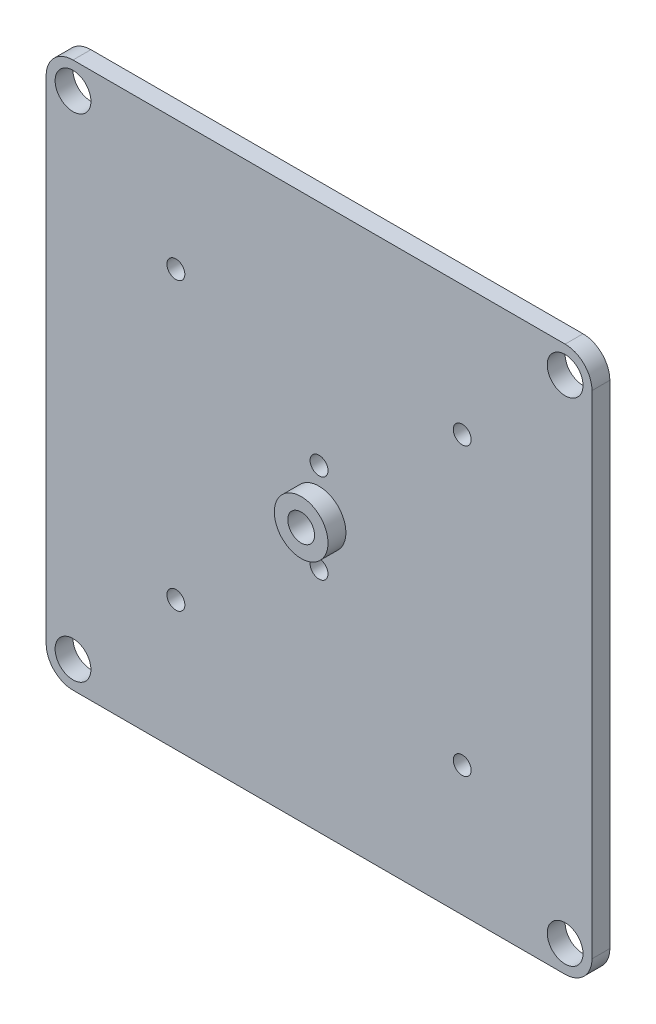
ISO-10303-21;
HEADER;
FILE_DESCRIPTION(('STEP AP214'),'2;1');
FILE_NAME('part.step','',(''),(''),'','','');
FILE_SCHEMA(('AUTOMOTIVE_DESIGN { 1 0 10303 214 1 1 1 1 }'));
ENDSEC;
DATA;
#1=APPLICATION_CONTEXT('core data for automotive mechanical design processes');
#2=APPLICATION_PROTOCOL_DEFINITION('international standard','automotive_design',2000,#1);
#3=PRODUCT_CONTEXT('',#1,'mechanical');
#4=PRODUCT('Part','Part','',(#3));
#5=PRODUCT_RELATED_PRODUCT_CATEGORY('part','',(#4));
#6=PRODUCT_DEFINITION_FORMATION('','',#4);
#7=PRODUCT_DEFINITION_CONTEXT('part definition',#1,'design');
#8=PRODUCT_DEFINITION('design','',#6,#7);
#9=PRODUCT_DEFINITION_SHAPE('','',#8);
#10=(LENGTH_UNIT() NAMED_UNIT(*) SI_UNIT(.MILLI.,.METRE.));
#11=(NAMED_UNIT(*) PLANE_ANGLE_UNIT() SI_UNIT($,.RADIAN.));
#12=(NAMED_UNIT(*) SI_UNIT($,.STERADIAN.) SOLID_ANGLE_UNIT());
#13=UNCERTAINTY_MEASURE_WITH_UNIT(LENGTH_MEASURE(1.E-05),#10,'distance_accuracy_value','');
#14=(GEOMETRIC_REPRESENTATION_CONTEXT(3) GLOBAL_UNCERTAINTY_ASSIGNED_CONTEXT((#13)) GLOBAL_UNIT_ASSIGNED_CONTEXT((#10,
#11,#12)) REPRESENTATION_CONTEXT('',''));
#15=CARTESIAN_POINT('',(0.,0.,0.));
#16=DIRECTION('',(0.,0.,1.));
#17=DIRECTION('',(1.,0.,0.));
#18=AXIS2_PLACEMENT_3D('',#15,#16,#17);
#19=CARTESIAN_POINT('',(-152.5,-152.5,10.));
#20=DIRECTION('',(1.,0.,0.));
#21=DIRECTION('',(0.,1.,0.));
#22=AXIS2_PLACEMENT_3D('',#19,#20,#21);
#23=PLANE('',#22);
#24=DIRECTION('',(0.,-1.,0.));
#25=VECTOR('',#24,1.);
#26=CARTESIAN_POINT('',(-152.5,-152.5,0.));
#27=LINE('',#26,#25);
#28=CARTESIAN_POINT('',(-152.5,137.5,0.));
#29=VERTEX_POINT('',#28);
#30=CARTESIAN_POINT('',(-152.5,-137.5,0.));
#31=VERTEX_POINT('',#30);
#32=EDGE_CURVE('E189',#29,#31,#27,.T.);
#33=ORIENTED_EDGE('',*,*,#32,.T.);
#34=DIRECTION('',(0.,0.,-1.));
#35=VECTOR('',#34,1.);
#36=CARTESIAN_POINT('',(-152.5,-137.5,10.));
#37=LINE('',#36,#35);
#38=CARTESIAN_POINT('',(-152.5,-137.5,10.));
#39=VERTEX_POINT('',#38);
#40=EDGE_CURVE('E50',#31,#39,#37,.F.);
#41=ORIENTED_EDGE('',*,*,#40,.T.);
#42=DIRECTION('',(0.,-1.,0.));
#43=VECTOR('',#42,1.);
#44=CARTESIAN_POINT('',(-152.5,-152.5,10.));
#45=LINE('',#44,#43);
#46=CARTESIAN_POINT('',(-152.5,137.5,10.));
#47=VERTEX_POINT('',#46);
#48=EDGE_CURVE('E138',#47,#39,#45,.T.);
#49=ORIENTED_EDGE('',*,*,#48,.F.);
#50=DIRECTION('',(0.,0.,-1.));
#51=VECTOR('',#50,1.);
#52=CARTESIAN_POINT('',(-152.5,137.5,10.));
#53=LINE('',#52,#51);
#54=EDGE_CURVE('E180',#47,#29,#53,.T.);
#55=ORIENTED_EDGE('',*,*,#54,.T.);
#56=EDGE_LOOP('',(#33,#41,#49,#55));
#57=FACE_BOUND('',#56,.T.);
#58=ADVANCED_FACE('F41',(#57),#23,.F.);
#59=CARTESIAN_POINT('',(-152.5,-152.5,10.));
#60=DIRECTION('',(0.,1.,0.));
#61=DIRECTION('',(0.,0.,1.));
#62=AXIS2_PLACEMENT_3D('',#59,#60,#61);
#63=PLANE('',#62);
#64=DIRECTION('',(1.,0.,0.));
#65=VECTOR('',#64,1.);
#66=CARTESIAN_POINT('',(-152.5,-152.5,0.));
#67=LINE('',#66,#65);
#68=CARTESIAN_POINT('',(-137.5,-152.5,0.));
#69=VERTEX_POINT('',#68);
#70=CARTESIAN_POINT('',(137.5,-152.5,0.));
#71=VERTEX_POINT('',#70);
#72=EDGE_CURVE('E145',#69,#71,#67,.T.);
#73=ORIENTED_EDGE('',*,*,#72,.T.);
#74=DIRECTION('',(0.,0.,-1.));
#75=VECTOR('',#74,1.);
#76=CARTESIAN_POINT('',(137.5,-152.5,10.));
#77=LINE('',#76,#75);
#78=CARTESIAN_POINT('',(137.5,-152.5,10.));
#79=VERTEX_POINT('',#78);
#80=EDGE_CURVE('E57',#71,#79,#77,.F.);
#81=ORIENTED_EDGE('',*,*,#80,.T.);
#82=DIRECTION('',(1.,0.,0.));
#83=VECTOR('',#82,1.);
#84=CARTESIAN_POINT('',(-152.5,-152.5,10.));
#85=LINE('',#84,#83);
#86=CARTESIAN_POINT('',(-137.5,-152.5,10.));
#87=VERTEX_POINT('',#86);
#88=EDGE_CURVE('E143',#87,#79,#85,.T.);
#89=ORIENTED_EDGE('',*,*,#88,.F.);
#90=DIRECTION('',(0.,0.,-1.));
#91=VECTOR('',#90,1.);
#92=CARTESIAN_POINT('',(-137.5,-152.5,10.));
#93=LINE('',#92,#91);
#94=EDGE_CURVE('E174',#87,#69,#93,.T.);
#95=ORIENTED_EDGE('',*,*,#94,.T.);
#96=EDGE_LOOP('',(#73,#81,#89,#95));
#97=FACE_BOUND('',#96,.T.);
#98=ADVANCED_FACE('F197',(#97),#63,.F.);
#99=CARTESIAN_POINT('',(152.5,-152.5,10.));
#100=DIRECTION('',(-1.,0.,0.));
#101=DIRECTION('',(0.,-1.,0.));
#102=AXIS2_PLACEMENT_3D('',#99,#100,#101);
#103=PLANE('',#102);
#104=DIRECTION('',(0.,1.,0.));
#105=VECTOR('',#104,1.);
#106=CARTESIAN_POINT('',(152.5,-152.5,0.));
#107=LINE('',#106,#105);
#108=CARTESIAN_POINT('',(152.5,-137.5,0.));
#109=VERTEX_POINT('',#108);
#110=CARTESIAN_POINT('',(152.5,137.5,0.));
#111=VERTEX_POINT('',#110);
#112=EDGE_CURVE('E139',#109,#111,#107,.T.);
#113=ORIENTED_EDGE('',*,*,#112,.T.);
#114=DIRECTION('',(0.,0.,-1.));
#115=VECTOR('',#114,1.);
#116=CARTESIAN_POINT('',(152.5,137.5,10.));
#117=LINE('',#116,#115);
#118=CARTESIAN_POINT('',(152.5,137.5,10.));
#119=VERTEX_POINT('',#118);
#120=EDGE_CURVE('E114',#111,#119,#117,.F.);
#121=ORIENTED_EDGE('',*,*,#120,.T.);
#122=DIRECTION('',(0.,1.,0.));
#123=VECTOR('',#122,1.);
#124=CARTESIAN_POINT('',(152.5,-152.5,10.));
#125=LINE('',#124,#123);
#126=CARTESIAN_POINT('',(152.5,-137.5,10.));
#127=VERTEX_POINT('',#126);
#128=EDGE_CURVE('E205',#127,#119,#125,.T.);
#129=ORIENTED_EDGE('',*,*,#128,.F.);
#130=DIRECTION('',(0.,0.,-1.));
#131=VECTOR('',#130,1.);
#132=CARTESIAN_POINT('',(152.5,-137.5,10.));
#133=LINE('',#132,#131);
#134=EDGE_CURVE('E120',#127,#109,#133,.T.);
#135=ORIENTED_EDGE('',*,*,#134,.T.);
#136=EDGE_LOOP('',(#113,#121,#129,#135));
#137=FACE_BOUND('',#136,.T.);
#138=ADVANCED_FACE('F354',(#137),#103,.F.);
#139=CARTESIAN_POINT('',(-152.5,152.5,10.));
#140=DIRECTION('',(0.,-1.,0.));
#141=DIRECTION('',(1.,0.,0.));
#142=AXIS2_PLACEMENT_3D('',#139,#140,#141);
#143=PLANE('',#142);
#144=DIRECTION('',(-1.,0.,0.));
#145=VECTOR('',#144,1.);
#146=CARTESIAN_POINT('',(-152.5,152.5,10.));
#147=LINE('',#146,#145);
#148=CARTESIAN_POINT('',(137.5,152.5,10.));
#149=VERTEX_POINT('',#148);
#150=CARTESIAN_POINT('',(-137.5,152.5,10.));
#151=VERTEX_POINT('',#150);
#152=EDGE_CURVE('E130',#149,#151,#147,.T.);
#153=ORIENTED_EDGE('',*,*,#152,.F.);
#154=DIRECTION('',(0.,0.,-1.));
#155=VECTOR('',#154,1.);
#156=CARTESIAN_POINT('',(137.5,152.5,10.));
#157=LINE('',#156,#155);
#158=CARTESIAN_POINT('',(137.5,152.5,0.));
#159=VERTEX_POINT('',#158);
#160=EDGE_CURVE('E113',#149,#159,#157,.T.);
#161=ORIENTED_EDGE('',*,*,#160,.T.);
#162=DIRECTION('',(-1.,0.,0.));
#163=VECTOR('',#162,1.);
#164=CARTESIAN_POINT('',(-152.5,152.5,0.));
#165=LINE('',#164,#163);
#166=CARTESIAN_POINT('',(-137.5,152.5,0.));
#167=VERTEX_POINT('',#166);
#168=EDGE_CURVE('E127',#159,#167,#165,.T.);
#169=ORIENTED_EDGE('',*,*,#168,.T.);
#170=DIRECTION('',(0.,0.,-1.));
#171=VECTOR('',#170,1.);
#172=CARTESIAN_POINT('',(-137.5,152.5,10.));
#173=LINE('',#172,#171);
#174=EDGE_CURVE('E133',#167,#151,#173,.F.);
#175=ORIENTED_EDGE('',*,*,#174,.T.);
#176=EDGE_LOOP('',(#153,#161,#169,#175));
#177=FACE_BOUND('',#176,.T.);
#178=ADVANCED_FACE('F126',(#177),#143,.F.);
#179=CARTESIAN_POINT('',(0.,0.,10.));
#180=DIRECTION('',(0.,0.,-1.));
#181=DIRECTION('',(-1.,0.,0.));
#182=AXIS2_PLACEMENT_3D('',#179,#180,#181);
#183=PLANE('',#182);
#184=CARTESIAN_POINT('',(0.,25.,10.));
#185=DIRECTION('',(0.,0.,1.));
#186=DIRECTION('',(1.,0.,0.));
#187=AXIS2_PLACEMENT_3D('',#184,#185,#186);
#188=CIRCLE('',#187,5.);
#189=CARTESIAN_POINT('',(5.,25.,10.));
#190=VERTEX_POINT('',#189);
#191=EDGE_CURVE('E294',#190,#190,#188,.T.);
#192=ORIENTED_EDGE('',*,*,#191,.F.);
#193=EDGE_LOOP('',(#192));
#194=FACE_BOUND('',#193,.T.);
#195=CARTESIAN_POINT('',(0.,-25.,10.));
#196=DIRECTION('',(0.,0.,1.));
#197=DIRECTION('',(1.,0.,0.));
#198=AXIS2_PLACEMENT_3D('',#195,#196,#197);
#199=CIRCLE('',#198,5.);
#200=CARTESIAN_POINT('',(5.00000000000001,-25.,10.));
#201=VERTEX_POINT('',#200);
#202=EDGE_CURVE('E286',#201,#201,#199,.T.);
#203=ORIENTED_EDGE('',*,*,#202,.F.);
#204=EDGE_LOOP('',(#203));
#205=FACE_BOUND('',#204,.T.);
#206=CARTESIAN_POINT('',(0.,0.,10.));
#207=DIRECTION('',(0.,0.,-1.));
#208=DIRECTION('',(-1.,0.,0.));
#209=AXIS2_PLACEMENT_3D('',#206,#207,#208);
#210=CIRCLE('',#209,15.);
#211=CARTESIAN_POINT('',(-15.,0.,10.));
#212=VERTEX_POINT('',#211);
#213=EDGE_CURVE('E11',#212,#212,#210,.F.);
#214=ORIENTED_EDGE('',*,*,#213,.F.);
#215=EDGE_LOOP('',(#214));
#216=FACE_BOUND('',#215,.T.);
#217=CARTESIAN_POINT('',(-80.,80.,10.));
#218=DIRECTION('',(0.,0.,1.));
#219=DIRECTION('',(1.,0.,0.));
#220=AXIS2_PLACEMENT_3D('',#217,#218,#219);
#221=CIRCLE('',#220,5.00000000000001);
#222=CARTESIAN_POINT('',(-75.,80.,10.));
#223=VERTEX_POINT('',#222);
#224=EDGE_CURVE('E250',#223,#223,#221,.T.);
#225=ORIENTED_EDGE('',*,*,#224,.F.);
#226=EDGE_LOOP('',(#225));
#227=FACE_BOUND('',#226,.T.);
#228=CARTESIAN_POINT('',(-80.,-80.,10.));
#229=DIRECTION('',(0.,0.,1.));
#230=DIRECTION('',(1.,0.,0.));
#231=AXIS2_PLACEMENT_3D('',#228,#229,#230);
#232=CIRCLE('',#231,5.00000000000001);
#233=CARTESIAN_POINT('',(-75.,-80.,10.));
#234=VERTEX_POINT('',#233);
#235=EDGE_CURVE('E259',#234,#234,#232,.T.);
#236=ORIENTED_EDGE('',*,*,#235,.F.);
#237=EDGE_LOOP('',(#236));
#238=FACE_BOUND('',#237,.T.);
#239=CARTESIAN_POINT('',(80.,-80.,10.));
#240=DIRECTION('',(0.,0.,1.));
#241=DIRECTION('',(1.,0.,0.));
#242=AXIS2_PLACEMENT_3D('',#239,#240,#241);
#243=CIRCLE('',#242,5.00000000000001);
#244=CARTESIAN_POINT('',(85.,-80.,10.));
#245=VERTEX_POINT('',#244);
#246=EDGE_CURVE('E267',#245,#245,#243,.T.);
#247=ORIENTED_EDGE('',*,*,#246,.F.);
#248=EDGE_LOOP('',(#247));
#249=FACE_BOUND('',#248,.T.);
#250=CARTESIAN_POINT('',(80.,80.,10.));
#251=DIRECTION('',(0.,0.,1.));
#252=DIRECTION('',(1.,0.,0.));
#253=AXIS2_PLACEMENT_3D('',#250,#251,#252);
#254=CIRCLE('',#253,5.00000000000001);
#255=CARTESIAN_POINT('',(85.,80.,10.));
#256=VERTEX_POINT('',#255);
#257=EDGE_CURVE('E242',#256,#256,#254,.T.);
#258=ORIENTED_EDGE('',*,*,#257,.F.);
#259=EDGE_LOOP('',(#258));
#260=FACE_BOUND('',#259,.T.);
#261=CARTESIAN_POINT('',(-137.5,137.5,10.));
#262=DIRECTION('',(0.,0.,1.));
#263=DIRECTION('',(1.,0.,0.));
#264=AXIS2_PLACEMENT_3D('',#261,#262,#263);
#265=CIRCLE('',#264,10.);
#266=CARTESIAN_POINT('',(-127.5,137.5,10.));
#267=VERTEX_POINT('',#266);
#268=EDGE_CURVE('E218',#267,#267,#265,.T.);
#269=ORIENTED_EDGE('',*,*,#268,.F.);
#270=EDGE_LOOP('',(#269));
#271=FACE_BOUND('',#270,.T.);
#272=CARTESIAN_POINT('',(-137.5,-137.5,10.));
#273=DIRECTION('',(0.,0.,1.));
#274=DIRECTION('',(1.,0.,0.));
#275=AXIS2_PLACEMENT_3D('',#272,#273,#274);
#276=CIRCLE('',#275,10.);
#277=CARTESIAN_POINT('',(-127.5,-137.5,10.));
#278=VERTEX_POINT('',#277);
#279=EDGE_CURVE('E227',#278,#278,#276,.T.);
#280=ORIENTED_EDGE('',*,*,#279,.F.);
#281=EDGE_LOOP('',(#280));
#282=FACE_BOUND('',#281,.T.);
#283=CARTESIAN_POINT('',(137.5,-137.5,10.));
#284=DIRECTION('',(0.,0.,1.));
#285=DIRECTION('',(1.,0.,0.));
#286=AXIS2_PLACEMENT_3D('',#283,#284,#285);
#287=CIRCLE('',#286,10.);
#288=CARTESIAN_POINT('',(147.5,-137.5,10.));
#289=VERTEX_POINT('',#288);
#290=EDGE_CURVE('E235',#289,#289,#287,.T.);
#291=ORIENTED_EDGE('',*,*,#290,.F.);
#292=EDGE_LOOP('',(#291));
#293=FACE_BOUND('',#292,.T.);
#294=CARTESIAN_POINT('',(137.5,137.5,10.));
#295=DIRECTION('',(0.,0.,1.));
#296=DIRECTION('',(1.,0.,0.));
#297=AXIS2_PLACEMENT_3D('',#294,#295,#296);
#298=CIRCLE('',#297,10.);
#299=CARTESIAN_POINT('',(147.5,137.5,10.));
#300=VERTEX_POINT('',#299);
#301=EDGE_CURVE('E210',#300,#300,#298,.T.);
#302=ORIENTED_EDGE('',*,*,#301,.F.);
#303=EDGE_LOOP('',(#302));
#304=FACE_BOUND('',#303,.T.);
#305=ORIENTED_EDGE('',*,*,#128,.T.);
#306=CARTESIAN_POINT('',(137.5,137.5,10.));
#307=DIRECTION('',(0.,0.,-1.));
#308=DIRECTION('',(-1.,0.,0.));
#309=AXIS2_PLACEMENT_3D('',#306,#307,#308);
#310=CIRCLE('',#309,15.);
#311=EDGE_CURVE('E171',#119,#149,#310,.F.);
#312=ORIENTED_EDGE('',*,*,#311,.T.);
#313=ORIENTED_EDGE('',*,*,#152,.T.);
#314=CARTESIAN_POINT('',(-137.5,137.5,10.));
#315=DIRECTION('',(0.,0.,-1.));
#316=DIRECTION('',(-1.,0.,0.));
#317=AXIS2_PLACEMENT_3D('',#314,#315,#316);
#318=CIRCLE('',#317,15.);
#319=EDGE_CURVE('E163',#151,#47,#318,.F.);
#320=ORIENTED_EDGE('',*,*,#319,.T.);
#321=ORIENTED_EDGE('',*,*,#48,.T.);
#322=CARTESIAN_POINT('',(-137.5,-137.5,10.));
#323=DIRECTION('',(0.,0.,-1.));
#324=DIRECTION('',(-1.,0.,0.));
#325=AXIS2_PLACEMENT_3D('',#322,#323,#324);
#326=CIRCLE('',#325,15.);
#327=EDGE_CURVE('E64',#39,#87,#326,.F.);
#328=ORIENTED_EDGE('',*,*,#327,.T.);
#329=ORIENTED_EDGE('',*,*,#88,.T.);
#330=CARTESIAN_POINT('',(137.5,-137.5,10.));
#331=DIRECTION('',(0.,0.,-1.));
#332=DIRECTION('',(-1.,0.,0.));
#333=AXIS2_PLACEMENT_3D('',#330,#331,#332);
#334=CIRCLE('',#333,15.);
#335=EDGE_CURVE('E168',#79,#127,#334,.F.);
#336=ORIENTED_EDGE('',*,*,#335,.T.);
#337=EDGE_LOOP('',(#305,#312,#313,#320,#321,#328,#329,#336));
#338=FACE_BOUND('',#337,.T.);
#339=ADVANCED_FACE('F192',(#194,#205,#216,#227,#238,#249,#260,#271,#282,#293,#304,#338),#183,.F.);
#340=CARTESIAN_POINT('',(0.,0.,0.));
#341=DIRECTION('',(0.,0.,-1.));
#342=DIRECTION('',(-1.,0.,0.));
#343=AXIS2_PLACEMENT_3D('',#340,#341,#342);
#344=PLANE('',#343);
#345=CARTESIAN_POINT('',(0.,25.,0.));
#346=DIRECTION('',(0.,0.,1.));
#347=DIRECTION('',(1.,0.,0.));
#348=AXIS2_PLACEMENT_3D('',#345,#346,#347);
#349=CIRCLE('',#348,5.);
#350=CARTESIAN_POINT('',(5.,25.,0.));
#351=VERTEX_POINT('',#350);
#352=EDGE_CURVE('E282',#351,#351,#349,.T.);
#353=ORIENTED_EDGE('',*,*,#352,.T.);
#354=EDGE_LOOP('',(#353));
#355=FACE_BOUND('',#354,.T.);
#356=CARTESIAN_POINT('',(0.,-25.,0.));
#357=DIRECTION('',(0.,0.,1.));
#358=DIRECTION('',(1.,0.,0.));
#359=AXIS2_PLACEMENT_3D('',#356,#357,#358);
#360=CIRCLE('',#359,5.);
#361=CARTESIAN_POINT('',(5.00000000000001,-25.,0.));
#362=VERTEX_POINT('',#361);
#363=EDGE_CURVE('E290',#362,#362,#360,.T.);
#364=ORIENTED_EDGE('',*,*,#363,.T.);
#365=EDGE_LOOP('',(#364));
#366=FACE_BOUND('',#365,.T.);
#367=CARTESIAN_POINT('',(0.,0.,0.));
#368=DIRECTION('',(0.,0.,1.));
#369=DIRECTION('',(1.,0.,0.));
#370=AXIS2_PLACEMENT_3D('',#367,#368,#369);
#371=CIRCLE('',#370,7.5);
#372=CARTESIAN_POINT('',(7.5,0.,0.));
#373=VERTEX_POINT('',#372);
#374=EDGE_CURVE('E277',#373,#373,#371,.T.);
#375=ORIENTED_EDGE('',*,*,#374,.T.);
#376=EDGE_LOOP('',(#375));
#377=FACE_BOUND('',#376,.T.);
#378=CARTESIAN_POINT('',(-80.,80.,0.));
#379=DIRECTION('',(0.,0.,1.));
#380=DIRECTION('',(1.,0.,0.));
#381=AXIS2_PLACEMENT_3D('',#378,#379,#380);
#382=CIRCLE('',#381,5.00000000000001);
#383=CARTESIAN_POINT('',(-75.,80.,0.));
#384=VERTEX_POINT('',#383);
#385=EDGE_CURVE('E254',#384,#384,#382,.T.);
#386=ORIENTED_EDGE('',*,*,#385,.T.);
#387=EDGE_LOOP('',(#386));
#388=FACE_BOUND('',#387,.T.);
#389=CARTESIAN_POINT('',(-80.,-80.,0.));
#390=DIRECTION('',(0.,0.,1.));
#391=DIRECTION('',(1.,0.,0.));
#392=AXIS2_PLACEMENT_3D('',#389,#390,#391);
#393=CIRCLE('',#392,5.00000000000001);
#394=CARTESIAN_POINT('',(-75.,-80.,0.));
#395=VERTEX_POINT('',#394);
#396=EDGE_CURVE('E263',#395,#395,#393,.T.);
#397=ORIENTED_EDGE('',*,*,#396,.T.);
#398=EDGE_LOOP('',(#397));
#399=FACE_BOUND('',#398,.T.);
#400=CARTESIAN_POINT('',(80.,-80.,0.));
#401=DIRECTION('',(0.,0.,1.));
#402=DIRECTION('',(1.,0.,0.));
#403=AXIS2_PLACEMENT_3D('',#400,#401,#402);
#404=CIRCLE('',#403,5.00000000000001);
#405=CARTESIAN_POINT('',(85.,-80.,0.));
#406=VERTEX_POINT('',#405);
#407=EDGE_CURVE('E246',#406,#406,#404,.T.);
#408=ORIENTED_EDGE('',*,*,#407,.T.);
#409=EDGE_LOOP('',(#408));
#410=FACE_BOUND('',#409,.T.);
#411=CARTESIAN_POINT('',(80.,80.,0.));
#412=DIRECTION('',(0.,0.,1.));
#413=DIRECTION('',(1.,0.,0.));
#414=AXIS2_PLACEMENT_3D('',#411,#412,#413);
#415=CIRCLE('',#414,5.00000000000001);
#416=CARTESIAN_POINT('',(85.,80.,0.));
#417=VERTEX_POINT('',#416);
#418=EDGE_CURVE('E223',#417,#417,#415,.T.);
#419=ORIENTED_EDGE('',*,*,#418,.T.);
#420=EDGE_LOOP('',(#419));
#421=FACE_BOUND('',#420,.T.);
#422=CARTESIAN_POINT('',(-137.5,137.5,0.));
#423=DIRECTION('',(0.,0.,1.));
#424=DIRECTION('',(1.,0.,0.));
#425=AXIS2_PLACEMENT_3D('',#422,#423,#424);
#426=CIRCLE('',#425,10.);
#427=CARTESIAN_POINT('',(-127.5,137.5,0.));
#428=VERTEX_POINT('',#427);
#429=EDGE_CURVE('E222',#428,#428,#426,.T.);
#430=ORIENTED_EDGE('',*,*,#429,.T.);
#431=EDGE_LOOP('',(#430));
#432=FACE_BOUND('',#431,.T.);
#433=CARTESIAN_POINT('',(-137.5,-137.5,0.));
#434=DIRECTION('',(0.,0.,1.));
#435=DIRECTION('',(1.,0.,0.));
#436=AXIS2_PLACEMENT_3D('',#433,#434,#435);
#437=CIRCLE('',#436,10.);
#438=CARTESIAN_POINT('',(-127.5,-137.5,0.));
#439=VERTEX_POINT('',#438);
#440=EDGE_CURVE('E231',#439,#439,#437,.T.);
#441=ORIENTED_EDGE('',*,*,#440,.T.);
#442=EDGE_LOOP('',(#441));
#443=FACE_BOUND('',#442,.T.);
#444=CARTESIAN_POINT('',(137.5,-137.5,0.));
#445=DIRECTION('',(0.,0.,1.));
#446=DIRECTION('',(1.,0.,0.));
#447=AXIS2_PLACEMENT_3D('',#444,#445,#446);
#448=CIRCLE('',#447,10.);
#449=CARTESIAN_POINT('',(147.5,-137.5,0.));
#450=VERTEX_POINT('',#449);
#451=EDGE_CURVE('E214',#450,#450,#448,.T.);
#452=ORIENTED_EDGE('',*,*,#451,.T.);
#453=EDGE_LOOP('',(#452));
#454=FACE_BOUND('',#453,.T.);
#455=CARTESIAN_POINT('',(137.5,137.5,0.));
#456=DIRECTION('',(0.,0.,1.));
#457=DIRECTION('',(1.,0.,0.));
#458=AXIS2_PLACEMENT_3D('',#455,#456,#457);
#459=CIRCLE('',#458,10.);
#460=CARTESIAN_POINT('',(147.5,137.5,0.));
#461=VERTEX_POINT('',#460);
#462=EDGE_CURVE('E200',#461,#461,#459,.T.);
#463=ORIENTED_EDGE('',*,*,#462,.T.);
#464=EDGE_LOOP('',(#463));
#465=FACE_BOUND('',#464,.T.);
#466=ORIENTED_EDGE('',*,*,#168,.F.);
#467=CARTESIAN_POINT('',(137.5,137.5,0.));
#468=DIRECTION('',(0.,0.,-1.));
#469=DIRECTION('',(-1.,0.,0.));
#470=AXIS2_PLACEMENT_3D('',#467,#468,#469);
#471=CIRCLE('',#470,15.);
#472=EDGE_CURVE('E109',#159,#111,#471,.T.);
#473=ORIENTED_EDGE('',*,*,#472,.T.);
#474=ORIENTED_EDGE('',*,*,#112,.F.);
#475=CARTESIAN_POINT('',(137.5,-137.5,0.));
#476=DIRECTION('',(0.,0.,-1.));
#477=DIRECTION('',(-1.,0.,0.));
#478=AXIS2_PLACEMENT_3D('',#475,#476,#477);
#479=CIRCLE('',#478,15.);
#480=EDGE_CURVE('E121',#109,#71,#479,.T.);
#481=ORIENTED_EDGE('',*,*,#480,.T.);
#482=ORIENTED_EDGE('',*,*,#72,.F.);
#483=CARTESIAN_POINT('',(-137.5,-137.5,0.));
#484=DIRECTION('',(0.,0.,-1.));
#485=DIRECTION('',(-1.,0.,0.));
#486=AXIS2_PLACEMENT_3D('',#483,#484,#485);
#487=CIRCLE('',#486,15.);
#488=EDGE_CURVE('E153',#69,#31,#487,.T.);
#489=ORIENTED_EDGE('',*,*,#488,.T.);
#490=ORIENTED_EDGE('',*,*,#32,.F.);
#491=CARTESIAN_POINT('',(-137.5,137.5,0.));
#492=DIRECTION('',(0.,0.,-1.));
#493=DIRECTION('',(-1.,0.,0.));
#494=AXIS2_PLACEMENT_3D('',#491,#492,#493);
#495=CIRCLE('',#494,15.);
#496=EDGE_CURVE('E132',#29,#167,#495,.T.);
#497=ORIENTED_EDGE('',*,*,#496,.T.);
#498=EDGE_LOOP('',(#466,#473,#474,#481,#482,#489,#490,#497));
#499=FACE_BOUND('',#498,.T.);
#500=ADVANCED_FACE('F135',(#355,#366,#377,#388,#399,#410,#421,#432,#443,#454,#465,#499),#344,.T.);
#501=CARTESIAN_POINT('',(137.5,137.5,0.));
#502=DIRECTION('',(0.,0.,1.));
#503=DIRECTION('',(1.,0.,0.));
#504=AXIS2_PLACEMENT_3D('',#501,#502,#503);
#505=CYLINDRICAL_SURFACE('',#504,10.);
#506=ORIENTED_EDGE('',*,*,#462,.F.);
#507=EDGE_LOOP('',(#506));
#508=FACE_BOUND('',#507,.T.);
#509=ORIENTED_EDGE('',*,*,#301,.T.);
#510=EDGE_LOOP('',(#509));
#511=FACE_BOUND('',#510,.T.);
#512=ADVANCED_FACE('F334',(#508,#511),#505,.F.);
#513=CARTESIAN_POINT('',(137.5,-137.5,0.));
#514=DIRECTION('',(0.,0.,1.));
#515=DIRECTION('',(1.,0.,0.));
#516=AXIS2_PLACEMENT_3D('',#513,#514,#515);
#517=CYLINDRICAL_SURFACE('',#516,10.);
#518=ORIENTED_EDGE('',*,*,#451,.F.);
#519=EDGE_LOOP('',(#518));
#520=FACE_BOUND('',#519,.T.);
#521=ORIENTED_EDGE('',*,*,#290,.T.);
#522=EDGE_LOOP('',(#521));
#523=FACE_BOUND('',#522,.T.);
#524=ADVANCED_FACE('F336',(#520,#523),#517,.F.);
#525=CARTESIAN_POINT('',(-137.5,-137.5,0.));
#526=DIRECTION('',(0.,0.,1.));
#527=DIRECTION('',(1.,0.,0.));
#528=AXIS2_PLACEMENT_3D('',#525,#526,#527);
#529=CYLINDRICAL_SURFACE('',#528,10.);
#530=ORIENTED_EDGE('',*,*,#440,.F.);
#531=EDGE_LOOP('',(#530));
#532=FACE_BOUND('',#531,.T.);
#533=ORIENTED_EDGE('',*,*,#279,.T.);
#534=EDGE_LOOP('',(#533));
#535=FACE_BOUND('',#534,.T.);
#536=ADVANCED_FACE('F343',(#532,#535),#529,.F.);
#537=CARTESIAN_POINT('',(-137.5,137.5,0.));
#538=DIRECTION('',(0.,0.,1.));
#539=DIRECTION('',(1.,0.,0.));
#540=AXIS2_PLACEMENT_3D('',#537,#538,#539);
#541=CYLINDRICAL_SURFACE('',#540,10.);
#542=ORIENTED_EDGE('',*,*,#429,.F.);
#543=EDGE_LOOP('',(#542));
#544=FACE_BOUND('',#543,.T.);
#545=ORIENTED_EDGE('',*,*,#268,.T.);
#546=EDGE_LOOP('',(#545));
#547=FACE_BOUND('',#546,.T.);
#548=ADVANCED_FACE('F361',(#544,#547),#541,.F.);
#549=CARTESIAN_POINT('',(137.5,137.5,10.));
#550=DIRECTION('',(0.,0.,-1.));
#551=DIRECTION('',(-1.,0.,0.));
#552=AXIS2_PLACEMENT_3D('',#549,#550,#551);
#553=CYLINDRICAL_SURFACE('',#552,15.);
#554=ORIENTED_EDGE('',*,*,#311,.F.);
#555=ORIENTED_EDGE('',*,*,#120,.F.);
#556=ORIENTED_EDGE('',*,*,#472,.F.);
#557=ORIENTED_EDGE('',*,*,#160,.F.);
#558=EDGE_LOOP('',(#554,#555,#556,#557));
#559=FACE_BOUND('',#558,.T.);
#560=ADVANCED_FACE('F112',(#559),#553,.T.);
#561=CARTESIAN_POINT('',(137.5,-137.5,10.));
#562=DIRECTION('',(0.,0.,-1.));
#563=DIRECTION('',(-1.,0.,0.));
#564=AXIS2_PLACEMENT_3D('',#561,#562,#563);
#565=CYLINDRICAL_SURFACE('',#564,15.);
#566=ORIENTED_EDGE('',*,*,#335,.F.);
#567=ORIENTED_EDGE('',*,*,#80,.F.);
#568=ORIENTED_EDGE('',*,*,#480,.F.);
#569=ORIENTED_EDGE('',*,*,#134,.F.);
#570=EDGE_LOOP('',(#566,#567,#568,#569));
#571=FACE_BOUND('',#570,.T.);
#572=ADVANCED_FACE('F360',(#571),#565,.T.);
#573=CARTESIAN_POINT('',(-137.5,-137.5,10.));
#574=DIRECTION('',(0.,0.,-1.));
#575=DIRECTION('',(-1.,0.,0.));
#576=AXIS2_PLACEMENT_3D('',#573,#574,#575);
#577=CYLINDRICAL_SURFACE('',#576,15.);
#578=ORIENTED_EDGE('',*,*,#327,.F.);
#579=ORIENTED_EDGE('',*,*,#40,.F.);
#580=ORIENTED_EDGE('',*,*,#488,.F.);
#581=ORIENTED_EDGE('',*,*,#94,.F.);
#582=EDGE_LOOP('',(#578,#579,#580,#581));
#583=FACE_BOUND('',#582,.T.);
#584=ADVANCED_FACE('F195',(#583),#577,.T.);
#585=CARTESIAN_POINT('',(-137.5,137.5,10.));
#586=DIRECTION('',(0.,0.,-1.));
#587=DIRECTION('',(-1.,0.,0.));
#588=AXIS2_PLACEMENT_3D('',#585,#586,#587);
#589=CYLINDRICAL_SURFACE('',#588,15.);
#590=ORIENTED_EDGE('',*,*,#319,.F.);
#591=ORIENTED_EDGE('',*,*,#174,.F.);
#592=ORIENTED_EDGE('',*,*,#496,.F.);
#593=ORIENTED_EDGE('',*,*,#54,.F.);
#594=EDGE_LOOP('',(#590,#591,#592,#593));
#595=FACE_BOUND('',#594,.T.);
#596=ADVANCED_FACE('F43',(#595),#589,.T.);
#597=CARTESIAN_POINT('',(80.,80.,0.));
#598=DIRECTION('',(0.,0.,1.));
#599=DIRECTION('',(1.,0.,0.));
#600=AXIS2_PLACEMENT_3D('',#597,#598,#599);
#601=CYLINDRICAL_SURFACE('',#600,5.00000000000001);
#602=ORIENTED_EDGE('',*,*,#418,.F.);
#603=EDGE_LOOP('',(#602));
#604=FACE_BOUND('',#603,.T.);
#605=ORIENTED_EDGE('',*,*,#257,.T.);
#606=EDGE_LOOP('',(#605));
#607=FACE_BOUND('',#606,.T.);
#608=ADVANCED_FACE('F368',(#604,#607),#601,.F.);
#609=CARTESIAN_POINT('',(80.,-80.,0.));
#610=DIRECTION('',(0.,0.,1.));
#611=DIRECTION('',(1.,0.,0.));
#612=AXIS2_PLACEMENT_3D('',#609,#610,#611);
#613=CYLINDRICAL_SURFACE('',#612,5.00000000000001);
#614=ORIENTED_EDGE('',*,*,#407,.F.);
#615=EDGE_LOOP('',(#614));
#616=FACE_BOUND('',#615,.T.);
#617=ORIENTED_EDGE('',*,*,#246,.T.);
#618=EDGE_LOOP('',(#617));
#619=FACE_BOUND('',#618,.T.);
#620=ADVANCED_FACE('F373',(#616,#619),#613,.F.);
#621=CARTESIAN_POINT('',(-80.,-80.,0.));
#622=DIRECTION('',(0.,0.,1.));
#623=DIRECTION('',(1.,0.,0.));
#624=AXIS2_PLACEMENT_3D('',#621,#622,#623);
#625=CYLINDRICAL_SURFACE('',#624,5.00000000000001);
#626=ORIENTED_EDGE('',*,*,#396,.F.);
#627=EDGE_LOOP('',(#626));
#628=FACE_BOUND('',#627,.T.);
#629=ORIENTED_EDGE('',*,*,#235,.T.);
#630=EDGE_LOOP('',(#629));
#631=FACE_BOUND('',#630,.T.);
#632=ADVANCED_FACE('F445',(#628,#631),#625,.F.);
#633=CARTESIAN_POINT('',(-80.,80.,0.));
#634=DIRECTION('',(0.,0.,1.));
#635=DIRECTION('',(1.,0.,0.));
#636=AXIS2_PLACEMENT_3D('',#633,#634,#635);
#637=CYLINDRICAL_SURFACE('',#636,5.00000000000001);
#638=ORIENTED_EDGE('',*,*,#385,.F.);
#639=EDGE_LOOP('',(#638));
#640=FACE_BOUND('',#639,.T.);
#641=ORIENTED_EDGE('',*,*,#224,.T.);
#642=EDGE_LOOP('',(#641));
#643=FACE_BOUND('',#642,.T.);
#644=ADVANCED_FACE('F437',(#640,#643),#637,.F.);
#645=CARTESIAN_POINT('',(0.,0.,20.));
#646=DIRECTION('',(0.,0.,-1.));
#647=DIRECTION('',(-1.,0.,0.));
#648=AXIS2_PLACEMENT_3D('',#645,#646,#647);
#649=CYLINDRICAL_SURFACE('',#648,15.);
#650=CARTESIAN_POINT('',(0.,0.,20.));
#651=DIRECTION('',(0.,0.,1.));
#652=DIRECTION('',(1.,0.,0.));
#653=AXIS2_PLACEMENT_3D('',#650,#651,#652);
#654=CIRCLE('',#653,15.);
#655=CARTESIAN_POINT('',(15.,0.,20.));
#656=VERTEX_POINT('',#655);
#657=EDGE_CURVE('E255',#656,#656,#654,.T.);
#658=ORIENTED_EDGE('',*,*,#657,.F.);
#659=EDGE_LOOP('',(#658));
#660=FACE_BOUND('',#659,.T.);
#661=ORIENTED_EDGE('',*,*,#213,.T.);
#662=EDGE_LOOP('',(#661));
#663=FACE_BOUND('',#662,.T.);
#664=ADVANCED_FACE('F429',(#660,#663),#649,.T.);
#665=CARTESIAN_POINT('',(0.,0.,20.));
#666=DIRECTION('',(0.,0.,1.));
#667=DIRECTION('',(1.,0.,0.));
#668=AXIS2_PLACEMENT_3D('',#665,#666,#667);
#669=PLANE('',#668);
#670=CARTESIAN_POINT('',(0.,0.,20.));
#671=DIRECTION('',(0.,0.,1.));
#672=DIRECTION('',(1.,0.,0.));
#673=AXIS2_PLACEMENT_3D('',#670,#671,#672);
#674=CIRCLE('',#673,7.5);
#675=CARTESIAN_POINT('',(7.5,0.,20.));
#676=VERTEX_POINT('',#675);
#677=EDGE_CURVE('E278',#676,#676,#674,.T.);
#678=ORIENTED_EDGE('',*,*,#677,.F.);
#679=EDGE_LOOP('',(#678));
#680=FACE_BOUND('',#679,.T.);
#681=ORIENTED_EDGE('',*,*,#657,.T.);
#682=EDGE_LOOP('',(#681));
#683=FACE_BOUND('',#682,.T.);
#684=ADVANCED_FACE('F422',(#680,#683),#669,.T.);
#685=CARTESIAN_POINT('',(0.,0.,0.));
#686=DIRECTION('',(0.,0.,1.));
#687=DIRECTION('',(1.,0.,0.));
#688=AXIS2_PLACEMENT_3D('',#685,#686,#687);
#689=CYLINDRICAL_SURFACE('',#688,7.5);
#690=ORIENTED_EDGE('',*,*,#374,.F.);
#691=EDGE_LOOP('',(#690));
#692=FACE_BOUND('',#691,.T.);
#693=ORIENTED_EDGE('',*,*,#677,.T.);
#694=EDGE_LOOP('',(#693));
#695=FACE_BOUND('',#694,.T.);
#696=ADVANCED_FACE('F407',(#692,#695),#689,.F.);
#697=CARTESIAN_POINT('',(0.,-25.,0.));
#698=DIRECTION('',(0.,0.,1.));
#699=DIRECTION('',(1.,0.,0.));
#700=AXIS2_PLACEMENT_3D('',#697,#698,#699);
#701=CYLINDRICAL_SURFACE('',#700,5.);
#702=ORIENTED_EDGE('',*,*,#363,.F.);
#703=EDGE_LOOP('',(#702));
#704=FACE_BOUND('',#703,.T.);
#705=ORIENTED_EDGE('',*,*,#202,.T.);
#706=EDGE_LOOP('',(#705));
#707=FACE_BOUND('',#706,.T.);
#708=ADVANCED_FACE('F307',(#704,#707),#701,.F.);
#709=CARTESIAN_POINT('',(0.,25.,0.));
#710=DIRECTION('',(0.,0.,1.));
#711=DIRECTION('',(1.,0.,0.));
#712=AXIS2_PLACEMENT_3D('',#709,#710,#711);
#713=CYLINDRICAL_SURFACE('',#712,5.);
#714=ORIENTED_EDGE('',*,*,#352,.F.);
#715=EDGE_LOOP('',(#714));
#716=FACE_BOUND('',#715,.T.);
#717=ORIENTED_EDGE('',*,*,#191,.T.);
#718=EDGE_LOOP('',(#717));
#719=FACE_BOUND('',#718,.T.);
#720=ADVANCED_FACE('F304',(#716,#719),#713,.F.);
#721=CLOSED_SHELL('',(#58,#98,#138,#178,#339,#500,#512,#524,#536,#548,#560,#572,#584,#596,#608,
#620,#632,#644,#664,#684,#696,#708,#720));
#722=MANIFOLD_SOLID_BREP('B2',#721);
#723=ADVANCED_BREP_SHAPE_REPRESENTATION('',(#18,#722),#14);
#724=SHAPE_DEFINITION_REPRESENTATION(#9,#723);
ENDSEC;
END-ISO-10303-21;
